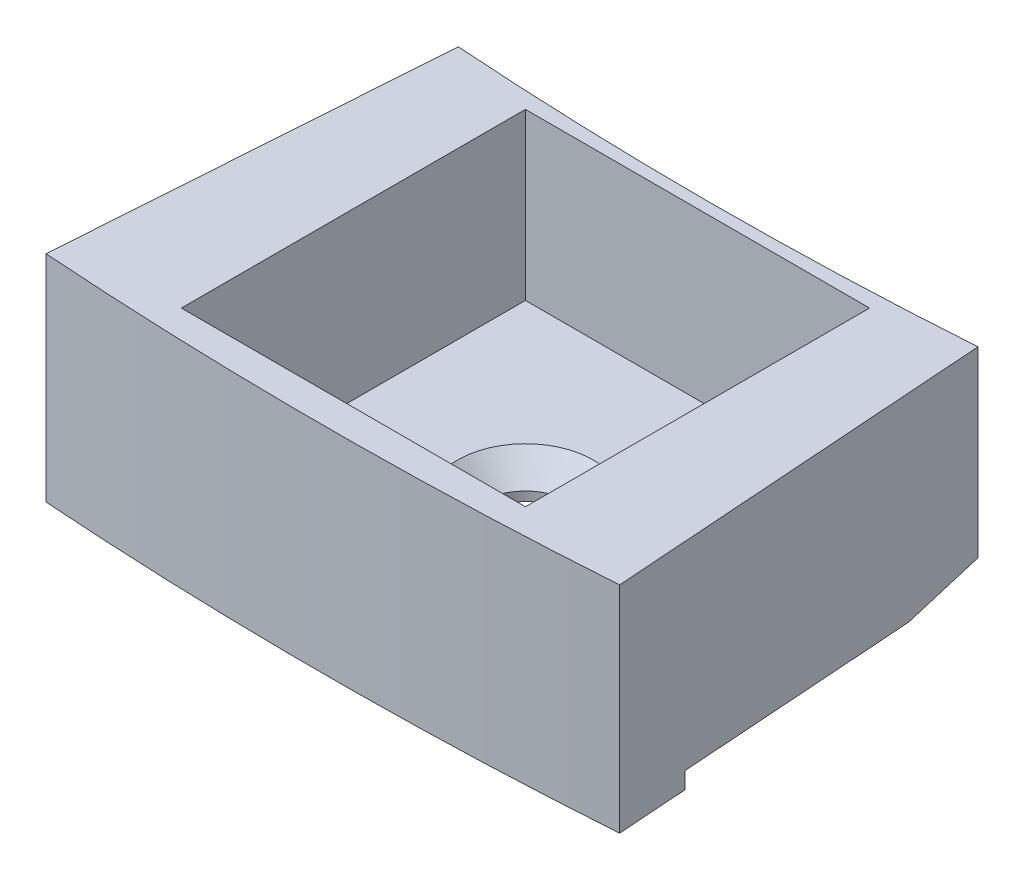
ISO-10303-21;
HEADER;
FILE_DESCRIPTION(('STEP AP214'),'2;1');
FILE_NAME('part.step','',(''),(''),'','','');
FILE_SCHEMA(('AUTOMOTIVE_DESIGN { 1 0 10303 214 1 1 1 1 }'));
ENDSEC;
DATA;
#1=APPLICATION_CONTEXT('core data for automotive mechanical design processes');
#2=APPLICATION_PROTOCOL_DEFINITION('international standard','automotive_design',2000,#1);
#3=PRODUCT_CONTEXT('',#1,'mechanical');
#4=PRODUCT('Part','Part','',(#3));
#5=PRODUCT_RELATED_PRODUCT_CATEGORY('part','',(#4));
#6=PRODUCT_DEFINITION_FORMATION('','',#4);
#7=PRODUCT_DEFINITION_CONTEXT('part definition',#1,'design');
#8=PRODUCT_DEFINITION('design','',#6,#7);
#9=PRODUCT_DEFINITION_SHAPE('','',#8);
#10=(LENGTH_UNIT() NAMED_UNIT(*) SI_UNIT(.MILLI.,.METRE.));
#11=(NAMED_UNIT(*) PLANE_ANGLE_UNIT() SI_UNIT($,.RADIAN.));
#12=(NAMED_UNIT(*) SI_UNIT($,.STERADIAN.) SOLID_ANGLE_UNIT());
#13=UNCERTAINTY_MEASURE_WITH_UNIT(LENGTH_MEASURE(1.E-05),#10,'distance_accuracy_value','');
#14=(GEOMETRIC_REPRESENTATION_CONTEXT(3) GLOBAL_UNCERTAINTY_ASSIGNED_CONTEXT((#13)) GLOBAL_UNIT_ASSIGNED_CONTEXT((#10,
#11,#12)) REPRESENTATION_CONTEXT('',''));
#15=CARTESIAN_POINT('',(0.,0.,0.));
#16=DIRECTION('',(0.,0.,1.));
#17=DIRECTION('',(1.,0.,0.));
#18=AXIS2_PLACEMENT_3D('',#15,#16,#17);
#19=CARTESIAN_POINT('',(-4.35114280077257E-12,0.,3.66381025475767E-12));
#20=DIRECTION('',(0.,-1.,0.));
#21=DIRECTION('',(0.,0.,-1.));
#22=AXIS2_PLACEMENT_3D('',#19,#20,#21);
#23=PLANE('',#22);
#24=CARTESIAN_POINT('',(0.,0.,236.25));
#25=DIRECTION('',(0.,1.,0.));
#26=DIRECTION('',(0.,0.,1.));
#27=AXIS2_PLACEMENT_3D('',#24,#25,#26);
#28=CIRCLE('',#27,2.65);
#29=CARTESIAN_POINT('',(0.,0.,238.9));
#30=VERTEX_POINT('',#29);
#31=EDGE_CURVE('E196',#30,#30,#28,.T.);
#32=ORIENTED_EDGE('',*,*,#31,.T.);
#33=EDGE_LOOP('',(#32));
#34=FACE_BOUND('',#33,.T.);
#35=CARTESIAN_POINT('',(0.,0.,0.));
#36=DIRECTION('',(0.,1.,0.));
#37=DIRECTION('',(0.,0.,1.));
#38=AXIS2_PLACEMENT_3D('',#35,#36,#37);
#39=CIRCLE('',#38,244.25);
#40=CARTESIAN_POINT('',(-17.0380187120024,0.,243.655019275962));
#41=VERTEX_POINT('',#40);
#42=CARTESIAN_POINT('',(17.0380187120027,0.,243.655019275962));
#43=VERTEX_POINT('',#42);
#44=EDGE_CURVE('E60',#41,#43,#39,.T.);
#45=ORIENTED_EDGE('',*,*,#44,.F.);
#46=DIRECTION('',(-0.0697564737441075,0.,0.997564050259826));
#47=VECTOR('',#46,1.);
#48=CARTESIAN_POINT('',(-15.9846959584666,0.,228.591802117042));
#49=LINE('',#48,#47);
#50=CARTESIAN_POINT('',(-16.0195741953386,0.,229.090584142172));
#51=VERTEX_POINT('',#50);
#52=EDGE_CURVE('E200',#51,#41,#49,.T.);
#53=ORIENTED_EDGE('',*,*,#52,.F.);
#54=CARTESIAN_POINT('',(0.,0.,0.));
#55=DIRECTION('',(0.,-1.,0.));
#56=DIRECTION('',(0.,0.,-1.));
#57=AXIS2_PLACEMENT_3D('',#54,#55,#56);
#58=CIRCLE('',#57,229.650000000004);
#59=CARTESIAN_POINT('',(16.0195741953387,0.,229.090584142172));
#60=VERTEX_POINT('',#59);
#61=EDGE_CURVE('E45',#51,#60,#58,.F.);
#62=ORIENTED_EDGE('',*,*,#61,.T.);
#63=DIRECTION('',(-0.0697564737441094,0.,-0.997564050259825));
#64=VECTOR('',#63,1.);
#65=CARTESIAN_POINT('',(15.9846959584666,0.,228.591802117042));
#66=LINE('',#65,#64);
#67=EDGE_CURVE('E202',#43,#60,#66,.T.);
#68=ORIENTED_EDGE('',*,*,#67,.F.);
#69=EDGE_LOOP('',(#45,#53,#62,#68));
#70=FACE_BOUND('',#69,.T.);
#71=ADVANCED_FACE('F35',(#34,#70),#23,.T.);
#72=CARTESIAN_POINT('',(-4.35114280077257E-12,2.,3.66381025475767E-12));
#73=DIRECTION('',(0.,-1.,0.));
#74=DIRECTION('',(0.,0.,-1.));
#75=AXIS2_PLACEMENT_3D('',#72,#73,#74);
#76=PLANE('',#75);
#77=DIRECTION('',(1.,0.,0.));
#78=VECTOR('',#77,1.);
#79=CARTESIAN_POINT('',(-10.4,2.,246.65));
#80=LINE('',#79,#78);
#81=CARTESIAN_POINT('',(-10.4,2.,246.65));
#82=VERTEX_POINT('',#81);
#83=CARTESIAN_POINT('',(10.4,2.,246.65));
#84=VERTEX_POINT('',#83);
#85=EDGE_CURVE('E130',#82,#84,#80,.T.);
#86=ORIENTED_EDGE('',*,*,#85,.T.);
#87=DIRECTION('',(0.,0.,-1.));
#88=VECTOR('',#87,1.);
#89=CARTESIAN_POINT('',(10.4,2.,225.85));
#90=LINE('',#89,#88);
#91=CARTESIAN_POINT('',(10.4,2.,225.85));
#92=VERTEX_POINT('',#91);
#93=EDGE_CURVE('E149',#84,#92,#90,.T.);
#94=ORIENTED_EDGE('',*,*,#93,.T.);
#95=DIRECTION('',(-1.,0.,0.));
#96=VECTOR('',#95,1.);
#97=CARTESIAN_POINT('',(-10.4,2.,225.85));
#98=LINE('',#97,#96);
#99=CARTESIAN_POINT('',(-10.4,2.,225.85));
#100=VERTEX_POINT('',#99);
#101=EDGE_CURVE('E136',#92,#100,#98,.T.);
#102=ORIENTED_EDGE('',*,*,#101,.T.);
#103=DIRECTION('',(0.,0.,1.));
#104=VECTOR('',#103,1.);
#105=CARTESIAN_POINT('',(-10.4,2.,225.85));
#106=LINE('',#105,#104);
#107=EDGE_CURVE('E152',#100,#82,#106,.T.);
#108=ORIENTED_EDGE('',*,*,#107,.T.);
#109=EDGE_LOOP('',(#86,#94,#102,#108));
#110=FACE_BOUND('',#109,.T.);
#111=CARTESIAN_POINT('',(0.,2.,236.25));
#112=DIRECTION('',(0.,1.,0.));
#113=DIRECTION('',(0.,0.,1.));
#114=AXIS2_PLACEMENT_3D('',#111,#112,#113);
#115=CIRCLE('',#114,4.1);
#116=CARTESIAN_POINT('',(0.,2.,240.35));
#117=VERTEX_POINT('',#116);
#118=EDGE_CURVE('E172',#117,#117,#115,.T.);
#119=ORIENTED_EDGE('',*,*,#118,.F.);
#120=EDGE_LOOP('',(#119));
#121=FACE_BOUND('',#120,.T.);
#122=ADVANCED_FACE('F252',(#110,#121),#76,.F.);
#123=CARTESIAN_POINT('',(-15.9846959584666,2.,228.591802117042));
#124=DIRECTION('',(0.997564050259826,0.,0.0697564737441075));
#125=DIRECTION('',(0.0697564737441075,0.,-0.997564050259826));
#126=AXIS2_PLACEMENT_3D('',#123,#124,#125);
#127=PLANE('',#126);
#128=DIRECTION('',(0.,1.,0.));
#129=VECTOR('',#128,1.);
#130=CARTESIAN_POINT('',(-15.7056700634945,0.,224.601545916003));
#131=LINE('',#130,#129);
#132=CARTESIAN_POINT('',(-15.7056700634945,0.956504527515105,224.601545916003));
#133=VERTEX_POINT('',#132);
#134=CARTESIAN_POINT('',(-15.7056700634945,12.,224.601545916003));
#135=VERTEX_POINT('',#134);
#136=EDGE_CURVE('E194',#133,#135,#131,.T.);
#137=ORIENTED_EDGE('',*,*,#136,.F.);
#138=DIRECTION('',(-0.0682321274284495,-0.207911690817758,0.975764882339946));
#139=VECTOR('',#138,1.);
#140=CARTESIAN_POINT('',(-4.09781873540611E-12,48.813614387521,-2.86547400089263E-13));
#141=LINE('',#140,#139);
#142=EDGE_CURVE('E211',#133,#51,#141,.T.);
#143=ORIENTED_EDGE('',*,*,#142,.T.);
#144=ORIENTED_EDGE('',*,*,#52,.T.);
#145=DIRECTION('',(0.,1.,0.));
#146=VECTOR('',#145,1.);
#147=CARTESIAN_POINT('',(-17.0380187120023,-1.,243.655019275962));
#148=LINE('',#147,#146);
#149=CARTESIAN_POINT('',(-17.0380187120023,-1.,243.655019275962));
#150=VERTEX_POINT('',#149);
#151=EDGE_CURVE('E186',#150,#41,#148,.T.);
#152=ORIENTED_EDGE('',*,*,#151,.F.);
#153=DIRECTION('',(0.0697564737441085,0.,-0.997564050259825));
#154=VECTOR('',#153,1.);
#155=CARTESIAN_POINT('',(-17.3344837254152,-1.,247.894666489571));
#156=LINE('',#155,#154);
#157=CARTESIAN_POINT('',(-17.3344837254152,-1.,247.894666489571));
#158=VERTEX_POINT('',#157);
#159=EDGE_CURVE('E184',#158,#150,#156,.T.);
#160=ORIENTED_EDGE('',*,*,#159,.F.);
#161=DIRECTION('',(0.,-1.,0.));
#162=VECTOR('',#161,1.);
#163=CARTESIAN_POINT('',(-17.3344837254152,2.,247.894666489571));
#164=LINE('',#163,#162);
#165=CARTESIAN_POINT('',(-17.3344837254152,12.,247.894666489571));
#166=VERTEX_POINT('',#165);
#167=EDGE_CURVE('E206',#166,#158,#164,.T.);
#168=ORIENTED_EDGE('',*,*,#167,.F.);
#169=DIRECTION('',(-0.0697564737439204,0.,0.997564050259839));
#170=VECTOR('',#169,1.);
#171=CARTESIAN_POINT('',(-15.7056700634945,12.,224.601545916003));
#172=LINE('',#171,#170);
#173=EDGE_CURVE('E169',#135,#166,#172,.T.);
#174=ORIENTED_EDGE('',*,*,#173,.F.);
#175=EDGE_LOOP('',(#137,#143,#144,#152,#160,#168,#174));
#176=FACE_BOUND('',#175,.T.);
#177=ADVANCED_FACE('F230',(#176),#127,.F.);
#178=CARTESIAN_POINT('',(-4.6074255521944E-12,2.,0.));
#179=DIRECTION('',(0.,-1.,0.));
#180=DIRECTION('',(0.,0.,-1.));
#181=AXIS2_PLACEMENT_3D('',#178,#179,#180);
#182=CYLINDRICAL_SURFACE('',#181,248.500000000005);
#183=ORIENTED_EDGE('',*,*,#167,.T.);
#184=CARTESIAN_POINT('',(0.,-1.,0.));
#185=DIRECTION('',(0.,-1.,0.));
#186=DIRECTION('',(0.,0.,1.));
#187=AXIS2_PLACEMENT_3D('',#184,#185,#186);
#188=CIRCLE('',#187,248.500000000005);
#189=CARTESIAN_POINT('',(17.3344837254153,-1.,247.894666489571));
#190=VERTEX_POINT('',#189);
#191=EDGE_CURVE('E181',#190,#158,#188,.T.);
#192=ORIENTED_EDGE('',*,*,#191,.F.);
#193=DIRECTION('',(0.,-1.,0.));
#194=VECTOR('',#193,1.);
#195=CARTESIAN_POINT('',(17.3344837254152,2.,247.894666489571));
#196=LINE('',#195,#194);
#197=CARTESIAN_POINT('',(17.3344837254152,12.,247.894666489571));
#198=VERTEX_POINT('',#197);
#199=EDGE_CURVE('E204',#198,#190,#196,.T.);
#200=ORIENTED_EDGE('',*,*,#199,.F.);
#201=CARTESIAN_POINT('',(-4.6074255521944E-12,12.,0.));
#202=DIRECTION('',(0.,1.,0.));
#203=DIRECTION('',(0.,0.,1.));
#204=AXIS2_PLACEMENT_3D('',#201,#202,#203);
#205=CIRCLE('',#204,248.500000000005);
#206=EDGE_CURVE('E137',#166,#198,#205,.T.);
#207=ORIENTED_EDGE('',*,*,#206,.F.);
#208=EDGE_LOOP('',(#183,#192,#200,#207));
#209=FACE_BOUND('',#208,.T.);
#210=ADVANCED_FACE('F235',(#209),#182,.T.);
#211=CARTESIAN_POINT('',(15.9846959584666,2.,228.591802117042));
#212=DIRECTION('',(-0.997564050259825,0.,0.0697564737441094));
#213=DIRECTION('',(0.0697564737441094,0.,0.997564050259825));
#214=AXIS2_PLACEMENT_3D('',#211,#212,#213);
#215=PLANE('',#214);
#216=ORIENTED_EDGE('',*,*,#199,.T.);
#217=DIRECTION('',(0.0697564737440471,0.,0.99756405025983));
#218=VECTOR('',#217,1.);
#219=CARTESIAN_POINT('',(17.3344837254152,-1.,247.894666489571));
#220=LINE('',#219,#218);
#221=CARTESIAN_POINT('',(17.0380187120027,-1.,243.655019275962));
#222=VERTEX_POINT('',#221);
#223=EDGE_CURVE('E178',#222,#190,#220,.T.);
#224=ORIENTED_EDGE('',*,*,#223,.F.);
#225=DIRECTION('',(0.,1.,0.));
#226=VECTOR('',#225,1.);
#227=CARTESIAN_POINT('',(17.0380187120027,-1.,243.655019275962));
#228=LINE('',#227,#226);
#229=EDGE_CURVE('E190',#222,#43,#228,.T.);
#230=ORIENTED_EDGE('',*,*,#229,.T.);
#231=ORIENTED_EDGE('',*,*,#67,.T.);
#232=DIRECTION('',(-0.0682321274284514,0.207911690817758,-0.975764882339946));
#233=VECTOR('',#232,1.);
#234=CARTESIAN_POINT('',(3.74479718894375E-12,48.813614387521,-2.61861728797796E-13));
#235=LINE('',#234,#233);
#236=CARTESIAN_POINT('',(15.7056700634855,0.956504527515105,224.601545916003));
#237=VERTEX_POINT('',#236);
#238=EDGE_CURVE('E11',#60,#237,#235,.T.);
#239=ORIENTED_EDGE('',*,*,#238,.T.);
#240=DIRECTION('',(0.,1.,0.));
#241=VECTOR('',#240,1.);
#242=CARTESIAN_POINT('',(15.7056700634855,0.,224.601545916003));
#243=LINE('',#242,#241);
#244=CARTESIAN_POINT('',(15.7056700634855,12.,224.601545916003));
#245=VERTEX_POINT('',#244);
#246=EDGE_CURVE('E193',#237,#245,#243,.T.);
#247=ORIENTED_EDGE('',*,*,#246,.T.);
#248=DIRECTION('',(-0.0697564737443098,0.,-0.997564050259811));
#249=VECTOR('',#248,1.);
#250=CARTESIAN_POINT('',(17.3344837254152,12.,247.894666489571));
#251=LINE('',#250,#249);
#252=EDGE_CURVE('E163',#198,#245,#251,.T.);
#253=ORIENTED_EDGE('',*,*,#252,.F.);
#254=EDGE_LOOP('',(#216,#224,#230,#231,#239,#247,#253));
#255=FACE_BOUND('',#254,.T.);
#256=ADVANCED_FACE('F220',(#255),#215,.F.);
#257=CARTESIAN_POINT('',(0.,2.,236.25));
#258=DIRECTION('',(0.,-1.,0.));
#259=DIRECTION('',(0.,0.,-1.));
#260=AXIS2_PLACEMENT_3D('',#257,#258,#259);
#261=CYLINDRICAL_SURFACE('',#260,2.65);
#262=CARTESIAN_POINT('',(0.,0.550000000000005,236.25));
#263=DIRECTION('',(0.,1.,0.));
#264=DIRECTION('',(0.,0.,1.));
#265=AXIS2_PLACEMENT_3D('',#262,#263,#264);
#266=CIRCLE('',#265,2.65);
#267=CARTESIAN_POINT('',(0.,0.550000000000005,238.9));
#268=VERTEX_POINT('',#267);
#269=EDGE_CURVE('E40',#268,#268,#266,.F.);
#270=ORIENTED_EDGE('',*,*,#269,.F.);
#271=EDGE_LOOP('',(#270));
#272=FACE_BOUND('',#271,.T.);
#273=ORIENTED_EDGE('',*,*,#31,.F.);
#274=EDGE_LOOP('',(#273));
#275=FACE_BOUND('',#274,.T.);
#276=ADVANCED_FACE('F264',(#272,#275),#261,.F.);
#277=CARTESIAN_POINT('',(0.,0.,0.));
#278=DIRECTION('',(0.,1.,0.));
#279=DIRECTION('',(0.,0.,1.));
#280=AXIS2_PLACEMENT_3D('',#277,#278,#279);
#281=CYLINDRICAL_SURFACE('',#280,225.150000000004);
#282=ORIENTED_EDGE('',*,*,#246,.F.);
#283=CARTESIAN_POINT('',(0.,0.956504527515105,0.));
#284=DIRECTION('',(0.,-1.,0.));
#285=DIRECTION('',(0.,0.,-1.));
#286=AXIS2_PLACEMENT_3D('',#283,#284,#285);
#287=CIRCLE('',#286,225.150000000004);
#288=EDGE_CURVE('E208',#237,#133,#287,.T.);
#289=ORIENTED_EDGE('',*,*,#288,.T.);
#290=ORIENTED_EDGE('',*,*,#136,.T.);
#291=CARTESIAN_POINT('',(0.,12.,0.));
#292=DIRECTION('',(0.,-1.,0.));
#293=DIRECTION('',(0.,0.,1.));
#294=AXIS2_PLACEMENT_3D('',#291,#292,#293);
#295=CIRCLE('',#294,225.150000000004);
#296=EDGE_CURVE('E166',#245,#135,#295,.T.);
#297=ORIENTED_EDGE('',*,*,#296,.F.);
#298=EDGE_LOOP('',(#282,#289,#290,#297));
#299=FACE_BOUND('',#298,.T.);
#300=ADVANCED_FACE('F224',(#299),#281,.F.);
#301=CARTESIAN_POINT('',(0.,0.956504527515105,0.));
#302=DIRECTION('',(0.,-1.,0.));
#303=DIRECTION('',(0.,0.,-1.));
#304=AXIS2_PLACEMENT_3D('',#301,#302,#303);
#305=CONICAL_SURFACE('',#304,225.150000000004,1.36135681655558);
#306=ORIENTED_EDGE('',*,*,#238,.F.);
#307=ORIENTED_EDGE('',*,*,#61,.F.);
#308=ORIENTED_EDGE('',*,*,#142,.F.);
#309=ORIENTED_EDGE('',*,*,#288,.F.);
#310=EDGE_LOOP('',(#306,#307,#308,#309));
#311=FACE_BOUND('',#310,.T.);
#312=ADVANCED_FACE('F38',(#311),#305,.F.);
#313=CARTESIAN_POINT('',(0.,-1.,0.));
#314=DIRECTION('',(0.,1.,0.));
#315=DIRECTION('',(0.,0.,1.));
#316=AXIS2_PLACEMENT_3D('',#313,#314,#315);
#317=CYLINDRICAL_SURFACE('',#316,244.25);
#318=ORIENTED_EDGE('',*,*,#44,.T.);
#319=ORIENTED_EDGE('',*,*,#229,.F.);
#320=CARTESIAN_POINT('',(0.,-1.,0.));
#321=DIRECTION('',(0.,1.,0.));
#322=DIRECTION('',(0.,0.,1.));
#323=AXIS2_PLACEMENT_3D('',#320,#321,#322);
#324=CIRCLE('',#323,244.25);
#325=EDGE_CURVE('E175',#150,#222,#324,.T.);
#326=ORIENTED_EDGE('',*,*,#325,.F.);
#327=ORIENTED_EDGE('',*,*,#151,.T.);
#328=EDGE_LOOP('',(#318,#319,#326,#327));
#329=FACE_BOUND('',#328,.T.);
#330=ADVANCED_FACE('F241',(#329),#317,.F.);
#331=CARTESIAN_POINT('',(0.,-1.,0.));
#332=DIRECTION('',(0.,1.,0.));
#333=DIRECTION('',(0.,0.,1.));
#334=AXIS2_PLACEMENT_3D('',#331,#332,#333);
#335=PLANE('',#334);
#336=ORIENTED_EDGE('',*,*,#325,.T.);
#337=ORIENTED_EDGE('',*,*,#223,.T.);
#338=ORIENTED_EDGE('',*,*,#191,.T.);
#339=ORIENTED_EDGE('',*,*,#159,.T.);
#340=EDGE_LOOP('',(#336,#337,#338,#339));
#341=FACE_BOUND('',#340,.T.);
#342=ADVANCED_FACE('F237',(#341),#335,.F.);
#343=CARTESIAN_POINT('',(0.,2.,236.25));
#344=DIRECTION('',(0.,1.,0.));
#345=DIRECTION('',(0.,0.,1.));
#346=AXIS2_PLACEMENT_3D('',#343,#344,#345);
#347=CONICAL_SURFACE('',#346,4.1,0.785398163397449);
#348=ORIENTED_EDGE('',*,*,#269,.T.);
#349=EDGE_LOOP('',(#348));
#350=FACE_BOUND('',#349,.T.);
#351=ORIENTED_EDGE('',*,*,#118,.T.);
#352=EDGE_LOOP('',(#351));
#353=FACE_BOUND('',#352,.T.);
#354=ADVANCED_FACE('F248',(#350,#353),#347,.F.);
#355=CARTESIAN_POINT('',(-4.6074255521944E-12,12.,0.));
#356=DIRECTION('',(0.,1.,0.));
#357=DIRECTION('',(0.,0.,1.));
#358=AXIS2_PLACEMENT_3D('',#355,#356,#357);
#359=PLANE('',#358);
#360=ORIENTED_EDGE('',*,*,#206,.T.);
#361=ORIENTED_EDGE('',*,*,#252,.T.);
#362=ORIENTED_EDGE('',*,*,#296,.T.);
#363=ORIENTED_EDGE('',*,*,#173,.T.);
#364=EDGE_LOOP('',(#360,#361,#362,#363));
#365=FACE_BOUND('',#364,.T.);
#366=DIRECTION('',(-1.,0.,0.));
#367=VECTOR('',#366,1.);
#368=CARTESIAN_POINT('',(-10.4,12.,225.85));
#369=LINE('',#368,#367);
#370=CARTESIAN_POINT('',(10.4,12.,225.85));
#371=VERTEX_POINT('',#370);
#372=CARTESIAN_POINT('',(-10.4,12.,225.85));
#373=VERTEX_POINT('',#372);
#374=EDGE_CURVE('E129',#371,#373,#369,.T.);
#375=ORIENTED_EDGE('',*,*,#374,.F.);
#376=DIRECTION('',(0.,0.,-1.));
#377=VECTOR('',#376,1.);
#378=CARTESIAN_POINT('',(10.4,12.,225.85));
#379=LINE('',#378,#377);
#380=CARTESIAN_POINT('',(10.4,12.,246.65));
#381=VERTEX_POINT('',#380);
#382=EDGE_CURVE('E121',#381,#371,#379,.T.);
#383=ORIENTED_EDGE('',*,*,#382,.F.);
#384=DIRECTION('',(1.,0.,0.));
#385=VECTOR('',#384,1.);
#386=CARTESIAN_POINT('',(-10.4,12.,246.65));
#387=LINE('',#386,#385);
#388=CARTESIAN_POINT('',(-10.4,12.,246.65));
#389=VERTEX_POINT('',#388);
#390=EDGE_CURVE('E145',#389,#381,#387,.T.);
#391=ORIENTED_EDGE('',*,*,#390,.F.);
#392=DIRECTION('',(0.,0.,1.));
#393=VECTOR('',#392,1.);
#394=CARTESIAN_POINT('',(-10.4,12.,225.85));
#395=LINE('',#394,#393);
#396=EDGE_CURVE('E143',#373,#389,#395,.T.);
#397=ORIENTED_EDGE('',*,*,#396,.F.);
#398=EDGE_LOOP('',(#375,#383,#391,#397));
#399=FACE_BOUND('',#398,.T.);
#400=ADVANCED_FACE('F141',(#365,#399),#359,.T.);
#401=CARTESIAN_POINT('',(10.4,12.,225.85));
#402=DIRECTION('',(-1.,0.,0.));
#403=DIRECTION('',(0.,0.,1.));
#404=AXIS2_PLACEMENT_3D('',#401,#402,#403);
#405=PLANE('',#404);
#406=ORIENTED_EDGE('',*,*,#93,.F.);
#407=DIRECTION('',(0.,-1.,0.));
#408=VECTOR('',#407,1.);
#409=CARTESIAN_POINT('',(10.4,12.,246.65));
#410=LINE('',#409,#408);
#411=EDGE_CURVE('E52',#381,#84,#410,.T.);
#412=ORIENTED_EDGE('',*,*,#411,.F.);
#413=ORIENTED_EDGE('',*,*,#382,.T.);
#414=DIRECTION('',(0.,-1.,0.));
#415=VECTOR('',#414,1.);
#416=CARTESIAN_POINT('',(10.4,12.,225.85));
#417=LINE('',#416,#415);
#418=EDGE_CURVE('E124',#371,#92,#417,.T.);
#419=ORIENTED_EDGE('',*,*,#418,.T.);
#420=EDGE_LOOP('',(#406,#412,#413,#419));
#421=FACE_BOUND('',#420,.T.);
#422=ADVANCED_FACE('F123',(#421),#405,.T.);
#423=CARTESIAN_POINT('',(-10.4,12.,225.85));
#424=DIRECTION('',(0.,0.,1.));
#425=DIRECTION('',(1.,0.,0.));
#426=AXIS2_PLACEMENT_3D('',#423,#424,#425);
#427=PLANE('',#426);
#428=ORIENTED_EDGE('',*,*,#101,.F.);
#429=ORIENTED_EDGE('',*,*,#418,.F.);
#430=ORIENTED_EDGE('',*,*,#374,.T.);
#431=DIRECTION('',(0.,-1.,0.));
#432=VECTOR('',#431,1.);
#433=CARTESIAN_POINT('',(-10.4,12.,225.85));
#434=LINE('',#433,#432);
#435=EDGE_CURVE('E138',#373,#100,#434,.T.);
#436=ORIENTED_EDGE('',*,*,#435,.T.);
#437=EDGE_LOOP('',(#428,#429,#430,#436));
#438=FACE_BOUND('',#437,.T.);
#439=ADVANCED_FACE('F133',(#438),#427,.T.);
#440=CARTESIAN_POINT('',(-10.4,12.,225.85));
#441=DIRECTION('',(1.,0.,0.));
#442=DIRECTION('',(0.,0.,-1.));
#443=AXIS2_PLACEMENT_3D('',#440,#441,#442);
#444=PLANE('',#443);
#445=ORIENTED_EDGE('',*,*,#107,.F.);
#446=ORIENTED_EDGE('',*,*,#435,.F.);
#447=ORIENTED_EDGE('',*,*,#396,.T.);
#448=DIRECTION('',(0.,-1.,0.));
#449=VECTOR('',#448,1.);
#450=CARTESIAN_POINT('',(-10.4,12.,246.65));
#451=LINE('',#450,#449);
#452=EDGE_CURVE('E158',#389,#82,#451,.T.);
#453=ORIENTED_EDGE('',*,*,#452,.T.);
#454=EDGE_LOOP('',(#445,#446,#447,#453));
#455=FACE_BOUND('',#454,.T.);
#456=ADVANCED_FACE('F339',(#455),#444,.T.);
#457=CARTESIAN_POINT('',(-10.4,12.,246.65));
#458=DIRECTION('',(0.,0.,-1.));
#459=DIRECTION('',(-1.,0.,0.));
#460=AXIS2_PLACEMENT_3D('',#457,#458,#459);
#461=PLANE('',#460);
#462=ORIENTED_EDGE('',*,*,#85,.F.);
#463=ORIENTED_EDGE('',*,*,#452,.F.);
#464=ORIENTED_EDGE('',*,*,#390,.T.);
#465=ORIENTED_EDGE('',*,*,#411,.T.);
#466=EDGE_LOOP('',(#462,#463,#464,#465));
#467=FACE_BOUND('',#466,.T.);
#468=ADVANCED_FACE('F346',(#467),#461,.T.);
#469=CLOSED_SHELL('',(#71,#122,#177,#210,#256,#276,#300,#312,#330,#342,#354,#400,#422,#439,#456,#468));
#470=MANIFOLD_SOLID_BREP('B2',#469);
#471=ADVANCED_BREP_SHAPE_REPRESENTATION('',(#18,#470),#14);
#472=SHAPE_DEFINITION_REPRESENTATION(#9,#471);
ENDSEC;
END-ISO-10303-21;
